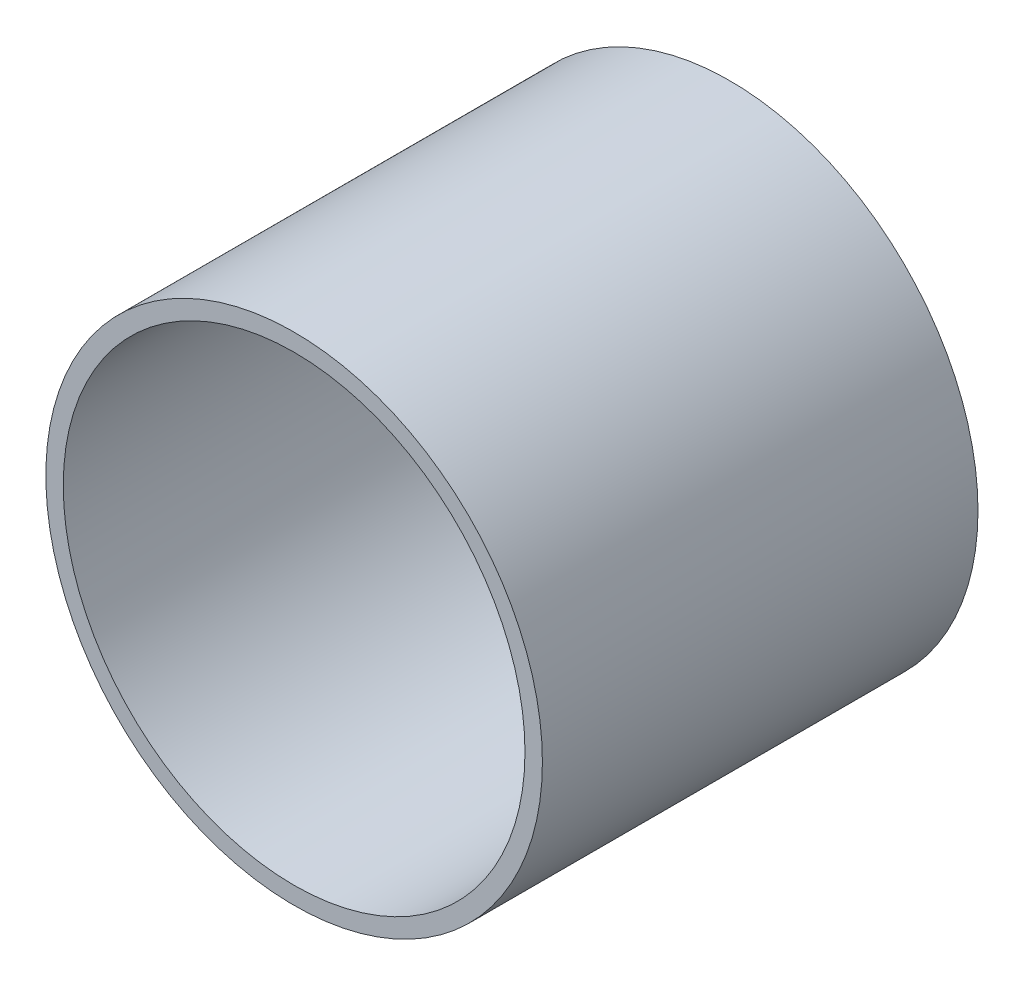
ISO-10303-21;
HEADER;
FILE_DESCRIPTION(('STEP AP214'),'2;1');
FILE_NAME('part.step','',(''),(''),'','','');
FILE_SCHEMA(('AUTOMOTIVE_DESIGN { 1 0 10303 214 1 1 1 1 }'));
ENDSEC;
DATA;
#1=APPLICATION_CONTEXT('core data for automotive mechanical design processes');
#2=APPLICATION_PROTOCOL_DEFINITION('international standard','automotive_design',2000,#1);
#3=PRODUCT_CONTEXT('',#1,'mechanical');
#4=PRODUCT('Part','Part','',(#3));
#5=PRODUCT_RELATED_PRODUCT_CATEGORY('part','',(#4));
#6=PRODUCT_DEFINITION_FORMATION('','',#4);
#7=PRODUCT_DEFINITION_CONTEXT('part definition',#1,'design');
#8=PRODUCT_DEFINITION('design','',#6,#7);
#9=PRODUCT_DEFINITION_SHAPE('','',#8);
#10=(LENGTH_UNIT() NAMED_UNIT(*) SI_UNIT(.MILLI.,.METRE.));
#11=(NAMED_UNIT(*) PLANE_ANGLE_UNIT() SI_UNIT($,.RADIAN.));
#12=(NAMED_UNIT(*) SI_UNIT($,.STERADIAN.) SOLID_ANGLE_UNIT());
#13=UNCERTAINTY_MEASURE_WITH_UNIT(LENGTH_MEASURE(1.E-05),#10,'distance_accuracy_value','');
#14=(GEOMETRIC_REPRESENTATION_CONTEXT(3) GLOBAL_UNCERTAINTY_ASSIGNED_CONTEXT((#13)) GLOBAL_UNIT_ASSIGNED_CONTEXT((#10,
#11,#12)) REPRESENTATION_CONTEXT('',''));
#15=CARTESIAN_POINT('',(0.,0.,0.));
#16=DIRECTION('',(0.,0.,1.));
#17=DIRECTION('',(1.,0.,0.));
#18=AXIS2_PLACEMENT_3D('',#15,#16,#17);
#19=CARTESIAN_POINT('',(0.,0.,500.));
#20=DIRECTION('',(0.,0.,-1.));
#21=DIRECTION('',(-1.,0.,0.));
#22=AXIS2_PLACEMENT_3D('',#19,#20,#21);
#23=CYLINDRICAL_SURFACE('',#22,285.);
#24=CARTESIAN_POINT('',(0.,0.,500.));
#25=DIRECTION('',(0.,0.,1.));
#26=DIRECTION('',(1.,0.,0.));
#27=AXIS2_PLACEMENT_3D('',#24,#25,#26);
#28=CIRCLE('',#27,285.);
#29=CARTESIAN_POINT('',(285.,0.,500.));
#30=VERTEX_POINT('',#29);
#31=EDGE_CURVE('E10',#30,#30,#28,.T.);
#32=ORIENTED_EDGE('',*,*,#31,.F.);
#33=EDGE_LOOP('',(#32));
#34=FACE_BOUND('',#33,.T.);
#35=CARTESIAN_POINT('',(0.,0.,0.));
#36=DIRECTION('',(0.,0.,1.));
#37=DIRECTION('',(1.,0.,0.));
#38=AXIS2_PLACEMENT_3D('',#35,#36,#37);
#39=CIRCLE('',#38,285.);
#40=CARTESIAN_POINT('',(285.,0.,0.));
#41=VERTEX_POINT('',#40);
#42=EDGE_CURVE('E38',#41,#41,#39,.T.);
#43=ORIENTED_EDGE('',*,*,#42,.T.);
#44=EDGE_LOOP('',(#43));
#45=FACE_BOUND('',#44,.T.);
#46=ADVANCED_FACE('F35',(#34,#45),#23,.T.);
#47=CARTESIAN_POINT('',(0.,0.,500.));
#48=DIRECTION('',(0.,0.,1.));
#49=DIRECTION('',(1.,0.,0.));
#50=AXIS2_PLACEMENT_3D('',#47,#48,#49);
#51=PLANE('',#50);
#52=CARTESIAN_POINT('',(0.,0.,500.));
#53=DIRECTION('',(0.,0.,1.));
#54=DIRECTION('',(1.,0.,0.));
#55=AXIS2_PLACEMENT_3D('',#52,#53,#54);
#56=CIRCLE('',#55,265.);
#57=CARTESIAN_POINT('',(265.,0.,500.));
#58=VERTEX_POINT('',#57);
#59=EDGE_CURVE('E47',#58,#58,#56,.T.);
#60=ORIENTED_EDGE('',*,*,#59,.F.);
#61=EDGE_LOOP('',(#60));
#62=FACE_BOUND('',#61,.T.);
#63=ORIENTED_EDGE('',*,*,#31,.T.);
#64=EDGE_LOOP('',(#63));
#65=FACE_BOUND('',#64,.T.);
#66=ADVANCED_FACE('F62',(#62,#65),#51,.T.);
#67=CARTESIAN_POINT('',(0.,0.,0.));
#68=DIRECTION('',(0.,0.,1.));
#69=DIRECTION('',(1.,0.,0.));
#70=AXIS2_PLACEMENT_3D('',#67,#68,#69);
#71=PLANE('',#70);
#72=ORIENTED_EDGE('',*,*,#42,.F.);
#73=EDGE_LOOP('',(#72));
#74=FACE_BOUND('',#73,.T.);
#75=ADVANCED_FACE('F58',(#74),#71,.F.);
#76=CARTESIAN_POINT('',(0.,0.,1.));
#77=DIRECTION('',(0.,0.,1.));
#78=DIRECTION('',(1.,0.,0.));
#79=AXIS2_PLACEMENT_3D('',#76,#77,#78);
#80=CYLINDRICAL_SURFACE('',#79,265.);
#81=CARTESIAN_POINT('',(0.,0.,1.));
#82=DIRECTION('',(0.,0.,1.));
#83=DIRECTION('',(1.,0.,0.));
#84=AXIS2_PLACEMENT_3D('',#81,#82,#83);
#85=CIRCLE('',#84,265.);
#86=CARTESIAN_POINT('',(265.,0.,1.));
#87=VERTEX_POINT('',#86);
#88=EDGE_CURVE('E45',#87,#87,#85,.T.);
#89=CARTESIAN_POINT('',(265.,0.,1.));
#90=CARTESIAN_POINT('',(265.,0.,6.19791666666667));
#91=CARTESIAN_POINT('',(265.,0.,11.3958333333333));
#92=CARTESIAN_POINT('',(265.,0.,21.7916666666667));
#93=CARTESIAN_POINT('',(265.,0.,26.9895833333333));
#94=CARTESIAN_POINT('',(265.,0.,37.3854166666667));
#95=CARTESIAN_POINT('',(265.,0.,42.5833333333333));
#96=CARTESIAN_POINT('',(265.,0.,52.9791666666667));
#97=CARTESIAN_POINT('',(265.,0.,58.1770833333333));
#98=CARTESIAN_POINT('',(265.,0.,68.5729166666667));
#99=CARTESIAN_POINT('',(265.,0.,73.7708333333333));
#100=CARTESIAN_POINT('',(265.,0.,84.1666666666667));
#101=CARTESIAN_POINT('',(265.,0.,89.3645833333333));
#102=CARTESIAN_POINT('',(265.,0.,99.7604166666666));
#103=CARTESIAN_POINT('',(265.,0.,104.958333333333));
#104=CARTESIAN_POINT('',(265.,0.,115.354166666667));
#105=CARTESIAN_POINT('',(265.,0.,120.552083333333));
#106=CARTESIAN_POINT('',(265.,0.,130.947916666667));
#107=CARTESIAN_POINT('',(265.,0.,136.145833333333));
#108=CARTESIAN_POINT('',(265.,0.,146.541666666667));
#109=CARTESIAN_POINT('',(265.,0.,151.739583333333));
#110=CARTESIAN_POINT('',(265.,0.,162.135416666667));
#111=CARTESIAN_POINT('',(265.,0.,167.333333333333));
#112=CARTESIAN_POINT('',(265.,0.,177.729166666667));
#113=CARTESIAN_POINT('',(265.,0.,182.927083333333));
#114=CARTESIAN_POINT('',(265.,0.,193.322916666667));
#115=CARTESIAN_POINT('',(265.,0.,198.520833333333));
#116=CARTESIAN_POINT('',(265.,0.,208.916666666667));
#117=CARTESIAN_POINT('',(265.,0.,214.114583333333));
#118=CARTESIAN_POINT('',(265.,0.,224.510416666667));
#119=CARTESIAN_POINT('',(265.,0.,229.708333333333));
#120=CARTESIAN_POINT('',(265.,0.,240.104166666667));
#121=CARTESIAN_POINT('',(265.,0.,245.302083333333));
#122=CARTESIAN_POINT('',(265.,0.,255.697916666667));
#123=CARTESIAN_POINT('',(265.,0.,260.895833333333));
#124=CARTESIAN_POINT('',(265.,0.,271.291666666667));
#125=CARTESIAN_POINT('',(265.,0.,276.489583333333));
#126=CARTESIAN_POINT('',(265.,0.,286.885416666667));
#127=CARTESIAN_POINT('',(265.,0.,292.083333333333));
#128=CARTESIAN_POINT('',(265.,0.,302.479166666667));
#129=CARTESIAN_POINT('',(265.,0.,307.677083333333));
#130=CARTESIAN_POINT('',(265.,0.,318.072916666667));
#131=CARTESIAN_POINT('',(265.,0.,323.270833333333));
#132=CARTESIAN_POINT('',(265.,0.,333.666666666667));
#133=CARTESIAN_POINT('',(265.,0.,338.864583333333));
#134=CARTESIAN_POINT('',(265.,0.,349.260416666667));
#135=CARTESIAN_POINT('',(265.,0.,354.458333333333));
#136=CARTESIAN_POINT('',(265.,0.,364.854166666667));
#137=CARTESIAN_POINT('',(265.,0.,370.052083333333));
#138=CARTESIAN_POINT('',(265.,0.,380.447916666667));
#139=CARTESIAN_POINT('',(265.,0.,385.645833333333));
#140=CARTESIAN_POINT('',(265.,0.,396.041666666667));
#141=CARTESIAN_POINT('',(265.,0.,401.239583333333));
#142=CARTESIAN_POINT('',(265.,0.,411.635416666667));
#143=CARTESIAN_POINT('',(265.,0.,416.833333333333));
#144=CARTESIAN_POINT('',(265.,0.,427.229166666667));
#145=CARTESIAN_POINT('',(265.,0.,432.427083333333));
#146=CARTESIAN_POINT('',(265.,0.,442.822916666667));
#147=CARTESIAN_POINT('',(265.,0.,448.020833333333));
#148=CARTESIAN_POINT('',(265.,0.,458.416666666667));
#149=CARTESIAN_POINT('',(265.,0.,463.614583333333));
#150=CARTESIAN_POINT('',(265.,0.,474.010416666667));
#151=CARTESIAN_POINT('',(265.,0.,479.208333333333));
#152=CARTESIAN_POINT('',(265.,0.,489.604166666667));
#153=CARTESIAN_POINT('',(265.,0.,494.802083333333));
#154=CARTESIAN_POINT('',(265.,0.,500.));
#155=B_SPLINE_CURVE_WITH_KNOTS('',3,(#89,#90,#91,#92,#93,#94,#95,#96,#97,#98,#99,#100,#101,#102,
#103,#104,#105,#106,#107,#108,#109,#110,#111,#112,#113,#114,#115,#116,#117,#118,#119,#120,#121,
#122,#123,#124,#125,#126,#127,#128,#129,#130,#131,#132,#133,#134,#135,#136,#137,#138,#139,#140,
#141,#142,#143,#144,#145,#146,#147,#148,#149,#150,#151,#152,#153,#154),.UNSPECIFIED.,.F.,.F.,(4,
2,2,2,2,2,2,2,2,2,2,2,2,2,2,2,2,2,2,2,2,2,2,2,2,2,2,2,2,2,2,2,4),(0.,15.59375,31.1875,46.78125,
62.375,77.96875,93.5625,109.15625,124.75,140.34375,155.9375,171.53125,187.125,202.71875,
218.3125,233.90625,249.5,265.09375,280.6875,296.28125,311.875,327.46875,343.0625,358.65625,
374.25,389.84375,405.4375,421.03125,436.625,452.21875,467.8125,483.40625,499.),.UNSPECIFIED.);
#156=EDGE_CURVE('BSEAM55',#87,#58,#155,.T.);
#157=ORIENTED_EDGE('',*,*,#88,.F.);
#158=ORIENTED_EDGE('',*,*,#59,.T.);
#159=ORIENTED_EDGE('',*,*,#156,.T.);
#160=ORIENTED_EDGE('',*,*,#156,.F.);
#161=EDGE_LOOP('',(#157,#159,#158,#160));
#162=FACE_BOUND('',#161,.T.);
#163=ADVANCED_FACE('F55',(#162),#80,.F.);
#164=CARTESIAN_POINT('',(0.,0.,1.));
#165=DIRECTION('',(0.,0.,1.));
#166=DIRECTION('',(1.,0.,0.));
#167=AXIS2_PLACEMENT_3D('',#164,#165,#166);
#168=PLANE('',#167);
#169=ORIENTED_EDGE('',*,*,#88,.T.);
#170=EDGE_LOOP('',(#169));
#171=FACE_BOUND('',#170,.T.);
#172=ADVANCED_FACE('F53',(#171),#168,.T.);
#173=CLOSED_SHELL('',(#46,#66,#75,#163,#172));
#174=MANIFOLD_SOLID_BREP('B2',#173);
#175=ADVANCED_BREP_SHAPE_REPRESENTATION('',(#18,#174),#14);
#176=SHAPE_DEFINITION_REPRESENTATION(#9,#175);
ENDSEC;
END-ISO-10303-21;
